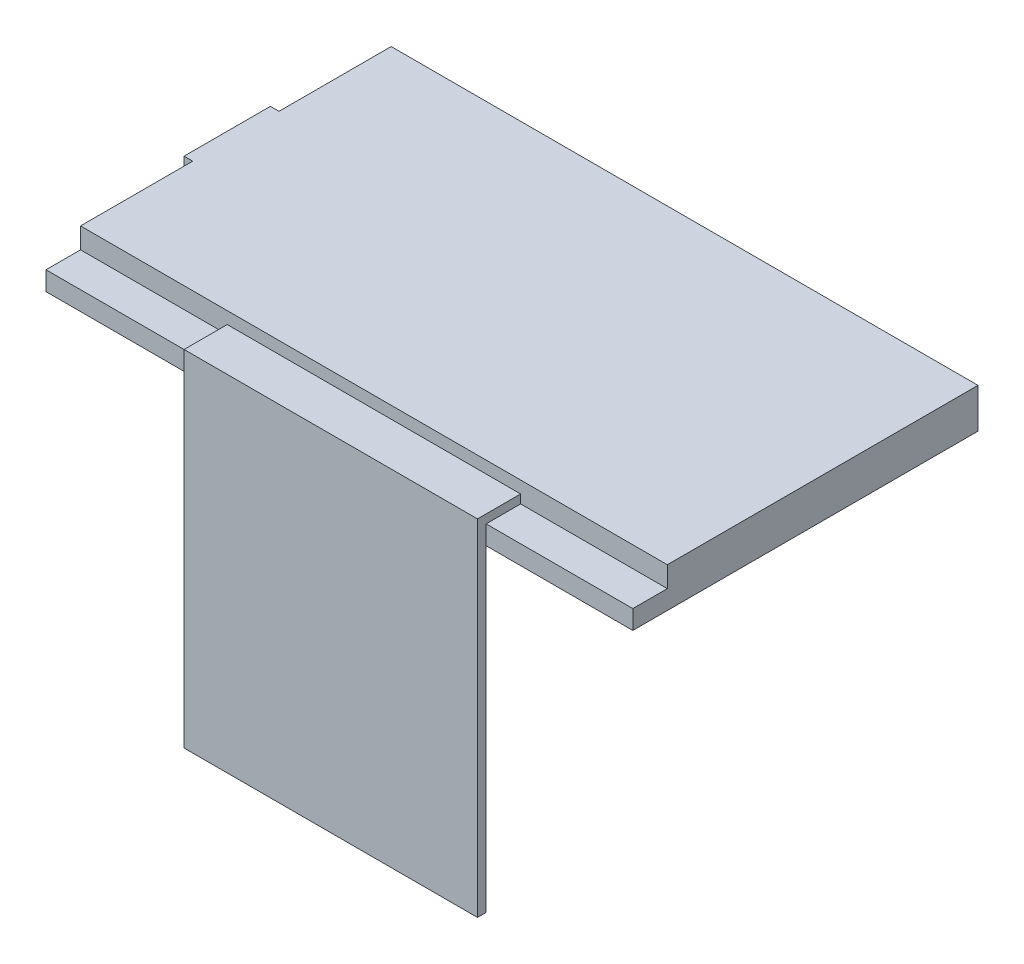
ISO-10303-21;
HEADER;
FILE_DESCRIPTION(('STEP AP214'),'2;1');
FILE_NAME('part.step','',(''),(''),'','','');
FILE_SCHEMA(('AUTOMOTIVE_DESIGN { 1 0 10303 214 1 1 1 1 }'));
ENDSEC;
DATA;
#1=APPLICATION_CONTEXT('core data for automotive mechanical design processes');
#2=APPLICATION_PROTOCOL_DEFINITION('international standard','automotive_design',2000,#1);
#3=PRODUCT_CONTEXT('',#1,'mechanical');
#4=PRODUCT('Part','Part','',(#3));
#5=PRODUCT_RELATED_PRODUCT_CATEGORY('part','',(#4));
#6=PRODUCT_DEFINITION_FORMATION('','',#4);
#7=PRODUCT_DEFINITION_CONTEXT('part definition',#1,'design');
#8=PRODUCT_DEFINITION('design','',#6,#7);
#9=PRODUCT_DEFINITION_SHAPE('','',#8);
#10=(LENGTH_UNIT() NAMED_UNIT(*) SI_UNIT(.MILLI.,.METRE.));
#11=(NAMED_UNIT(*) PLANE_ANGLE_UNIT() SI_UNIT($,.RADIAN.));
#12=(NAMED_UNIT(*) SI_UNIT($,.STERADIAN.) SOLID_ANGLE_UNIT());
#13=UNCERTAINTY_MEASURE_WITH_UNIT(LENGTH_MEASURE(1.E-05),#10,'distance_accuracy_value','');
#14=(GEOMETRIC_REPRESENTATION_CONTEXT(3) GLOBAL_UNCERTAINTY_ASSIGNED_CONTEXT((#13)) GLOBAL_UNIT_ASSIGNED_CONTEXT((#10,
#11,#12)) REPRESENTATION_CONTEXT('',''));
#15=CARTESIAN_POINT('',(0.,0.,0.));
#16=DIRECTION('',(0.,0.,1.));
#17=DIRECTION('',(1.,0.,0.));
#18=AXIS2_PLACEMENT_3D('',#15,#16,#17);
#19=CARTESIAN_POINT('',(-17.,1.1,10.));
#20=DIRECTION('',(0.,0.,-1.));
#21=DIRECTION('',(-1.,0.,0.));
#22=AXIS2_PLACEMENT_3D('',#19,#20,#21);
#23=PLANE('',#22);
#24=DIRECTION('',(0.,1.,0.));
#25=VECTOR('',#24,1.);
#26=CARTESIAN_POINT('',(8.5,-18.4,10.));
#27=LINE('',#26,#25);
#28=CARTESIAN_POINT('',(8.5,0.,10.));
#29=VERTEX_POINT('',#28);
#30=CARTESIAN_POINT('',(8.5,1.1,10.));
#31=VERTEX_POINT('',#30);
#32=EDGE_CURVE('E11',#29,#31,#27,.T.);
#33=ORIENTED_EDGE('',*,*,#32,.F.);
#34=DIRECTION('',(1.,0.,0.));
#35=VECTOR('',#34,1.);
#36=CARTESIAN_POINT('',(-17.,0.,10.));
#37=LINE('',#36,#35);
#38=CARTESIAN_POINT('',(17.,0.,10.));
#39=VERTEX_POINT('',#38);
#40=EDGE_CURVE('E277',#29,#39,#37,.T.);
#41=ORIENTED_EDGE('',*,*,#40,.T.);
#42=DIRECTION('',(0.,-1.,0.));
#43=VECTOR('',#42,1.);
#44=CARTESIAN_POINT('',(17.,1.1,10.));
#45=LINE('',#44,#43);
#46=CARTESIAN_POINT('',(17.,1.1,10.));
#47=VERTEX_POINT('',#46);
#48=EDGE_CURVE('E269',#47,#39,#45,.T.);
#49=ORIENTED_EDGE('',*,*,#48,.F.);
#50=DIRECTION('',(1.,0.,0.));
#51=VECTOR('',#50,1.);
#52=CARTESIAN_POINT('',(-17.,1.1,10.));
#53=LINE('',#52,#51);
#54=EDGE_CURVE('E265',#31,#47,#53,.T.);
#55=ORIENTED_EDGE('',*,*,#54,.F.);
#56=EDGE_LOOP('',(#33,#41,#49,#55));
#57=FACE_BOUND('',#56,.T.);
#58=ADVANCED_FACE('F33',(#57),#23,.F.);
#59=CARTESIAN_POINT('',(0.,1.1,0.));
#60=DIRECTION('',(0.,-1.,0.));
#61=DIRECTION('',(0.,0.,-1.));
#62=AXIS2_PLACEMENT_3D('',#59,#60,#61);
#63=PLANE('',#62);
#64=DIRECTION('',(0.,0.,1.));
#65=VECTOR('',#64,1.);
#66=CARTESIAN_POINT('',(-8.5,1.1,10.));
#67=LINE('',#66,#65);
#68=CARTESIAN_POINT('',(-8.5,1.1,8.));
#69=VERTEX_POINT('',#68);
#70=CARTESIAN_POINT('',(-8.5,1.1,10.));
#71=VERTEX_POINT('',#70);
#72=EDGE_CURVE('E188',#69,#71,#67,.T.);
#73=ORIENTED_EDGE('',*,*,#72,.F.);
#74=DIRECTION('',(1.,0.,0.));
#75=VECTOR('',#74,1.);
#76=CARTESIAN_POINT('',(-17.,1.1,8.));
#77=LINE('',#76,#75);
#78=CARTESIAN_POINT('',(-17.,1.1,8.));
#79=VERTEX_POINT('',#78);
#80=EDGE_CURVE('E250',#79,#69,#77,.T.);
#81=ORIENTED_EDGE('',*,*,#80,.F.);
#82=DIRECTION('',(0.,0.,1.));
#83=VECTOR('',#82,1.);
#84=CARTESIAN_POINT('',(-17.,1.1,10.));
#85=LINE('',#84,#83);
#86=CARTESIAN_POINT('',(-17.,1.1,10.));
#87=VERTEX_POINT('',#86);
#88=EDGE_CURVE('E262',#79,#87,#85,.T.);
#89=ORIENTED_EDGE('',*,*,#88,.T.);
#90=EDGE_CURVE('E266',#87,#71,#53,.T.);
#91=ORIENTED_EDGE('',*,*,#90,.T.);
#92=EDGE_LOOP('',(#73,#81,#89,#91));
#93=FACE_BOUND('',#92,.T.);
#94=ADVANCED_FACE('F308',(#93),#63,.F.);
#95=DIRECTION('',(0.,0.,-1.));
#96=VECTOR('',#95,1.);
#97=CARTESIAN_POINT('',(8.5,1.1,10.));
#98=LINE('',#97,#96);
#99=CARTESIAN_POINT('',(8.5,1.1,8.));
#100=VERTEX_POINT('',#99);
#101=EDGE_CURVE('E195',#31,#100,#98,.T.);
#102=ORIENTED_EDGE('',*,*,#101,.F.);
#103=ORIENTED_EDGE('',*,*,#54,.T.);
#104=DIRECTION('',(0.,0.,-1.));
#105=VECTOR('',#104,1.);
#106=CARTESIAN_POINT('',(17.,1.1,10.));
#107=LINE('',#106,#105);
#108=CARTESIAN_POINT('',(17.,1.1,8.));
#109=VERTEX_POINT('',#108);
#110=EDGE_CURVE('E259',#47,#109,#107,.T.);
#111=ORIENTED_EDGE('',*,*,#110,.T.);
#112=EDGE_CURVE('E236',#100,#109,#77,.T.);
#113=ORIENTED_EDGE('',*,*,#112,.F.);
#114=EDGE_LOOP('',(#102,#103,#111,#113));
#115=FACE_BOUND('',#114,.T.);
#116=ADVANCED_FACE('F338',(#115),#63,.F.);
#117=CARTESIAN_POINT('',(-17.,2.3,8.));
#118=DIRECTION('',(0.,0.,-1.));
#119=DIRECTION('',(-1.,0.,0.));
#120=AXIS2_PLACEMENT_3D('',#117,#118,#119);
#121=PLANE('',#120);
#122=DIRECTION('',(0.,-1.,0.));
#123=VECTOR('',#122,1.);
#124=CARTESIAN_POINT('',(-8.5,1.6,8.));
#125=LINE('',#124,#123);
#126=CARTESIAN_POINT('',(-8.5,1.6,8.));
#127=VERTEX_POINT('',#126);
#128=EDGE_CURVE('E201',#127,#69,#125,.T.);
#129=ORIENTED_EDGE('',*,*,#128,.F.);
#130=DIRECTION('',(-1.,0.,0.));
#131=VECTOR('',#130,1.);
#132=CARTESIAN_POINT('',(-8.5,1.6,8.));
#133=LINE('',#132,#131);
#134=CARTESIAN_POINT('',(8.5,1.6,8.));
#135=VERTEX_POINT('',#134);
#136=EDGE_CURVE('E198',#135,#127,#133,.T.);
#137=ORIENTED_EDGE('',*,*,#136,.F.);
#138=DIRECTION('',(0.,-1.,0.));
#139=VECTOR('',#138,1.);
#140=CARTESIAN_POINT('',(8.5,1.6,7.99999999999999));
#141=LINE('',#140,#139);
#142=EDGE_CURVE('E207',#135,#100,#141,.T.);
#143=ORIENTED_EDGE('',*,*,#142,.T.);
#144=ORIENTED_EDGE('',*,*,#112,.T.);
#145=DIRECTION('',(0.,-1.,0.));
#146=VECTOR('',#145,1.);
#147=CARTESIAN_POINT('',(17.,2.3,8.));
#148=LINE('',#147,#146);
#149=CARTESIAN_POINT('',(17.,2.3,8.));
#150=VERTEX_POINT('',#149);
#151=EDGE_CURVE('E249',#150,#109,#148,.T.);
#152=ORIENTED_EDGE('',*,*,#151,.F.);
#153=DIRECTION('',(1.,0.,0.));
#154=VECTOR('',#153,1.);
#155=CARTESIAN_POINT('',(-17.,2.3,8.));
#156=LINE('',#155,#154);
#157=CARTESIAN_POINT('',(-17.,2.3,8.));
#158=VERTEX_POINT('',#157);
#159=EDGE_CURVE('E240',#158,#150,#156,.T.);
#160=ORIENTED_EDGE('',*,*,#159,.F.);
#161=DIRECTION('',(0.,-1.,0.));
#162=VECTOR('',#161,1.);
#163=CARTESIAN_POINT('',(-17.,2.3,8.));
#164=LINE('',#163,#162);
#165=EDGE_CURVE('E255',#158,#79,#164,.T.);
#166=ORIENTED_EDGE('',*,*,#165,.T.);
#167=ORIENTED_EDGE('',*,*,#80,.T.);
#168=EDGE_LOOP('',(#129,#137,#143,#144,#152,#160,#166,#167));
#169=FACE_BOUND('',#168,.T.);
#170=ADVANCED_FACE('F303',(#169),#121,.F.);
#171=CARTESIAN_POINT('',(-17.,1.1,10.));
#172=DIRECTION('',(1.,0.,0.));
#173=DIRECTION('',(0.,0.,-1.));
#174=AXIS2_PLACEMENT_3D('',#171,#172,#173);
#175=PLANE('',#174);
#176=DIRECTION('',(0.,-1.,0.));
#177=VECTOR('',#176,1.);
#178=CARTESIAN_POINT('',(-17.,0.,-3.5));
#179=LINE('',#178,#177);
#180=CARTESIAN_POINT('',(-17.,2.3,-3.5));
#181=VERTEX_POINT('',#180);
#182=CARTESIAN_POINT('',(-17.,0.,-3.5));
#183=VERTEX_POINT('',#182);
#184=EDGE_CURVE('E209',#181,#183,#179,.T.);
#185=ORIENTED_EDGE('',*,*,#184,.F.);
#186=DIRECTION('',(0.,0.,1.));
#187=VECTOR('',#186,1.);
#188=CARTESIAN_POINT('',(-17.,2.3,-10.));
#189=LINE('',#188,#187);
#190=CARTESIAN_POINT('',(-17.,2.3,-10.));
#191=VERTEX_POINT('',#190);
#192=EDGE_CURVE('E237',#191,#181,#189,.T.);
#193=ORIENTED_EDGE('',*,*,#192,.F.);
#194=DIRECTION('',(0.,-1.,0.));
#195=VECTOR('',#194,1.);
#196=CARTESIAN_POINT('',(-17.,1.1,-10.));
#197=LINE('',#196,#195);
#198=CARTESIAN_POINT('',(-17.,0.,-10.));
#199=VERTEX_POINT('',#198);
#200=EDGE_CURVE('E283',#191,#199,#197,.T.);
#201=ORIENTED_EDGE('',*,*,#200,.T.);
#202=DIRECTION('',(0.,0.,1.));
#203=VECTOR('',#202,1.);
#204=CARTESIAN_POINT('',(-17.,0.,10.));
#205=LINE('',#204,#203);
#206=EDGE_CURVE('E275',#199,#183,#205,.T.);
#207=ORIENTED_EDGE('',*,*,#206,.T.);
#208=EDGE_LOOP('',(#185,#193,#201,#207));
#209=FACE_BOUND('',#208,.T.);
#210=ADVANCED_FACE('F328',(#209),#175,.F.);
#211=DIRECTION('',(0.,1.,0.));
#212=VECTOR('',#211,1.);
#213=CARTESIAN_POINT('',(-17.,0.,1.5));
#214=LINE('',#213,#212);
#215=CARTESIAN_POINT('',(-17.,0.,1.5));
#216=VERTEX_POINT('',#215);
#217=CARTESIAN_POINT('',(-17.,2.3,1.5));
#218=VERTEX_POINT('',#217);
#219=EDGE_CURVE('E214',#216,#218,#214,.T.);
#220=ORIENTED_EDGE('',*,*,#219,.F.);
#221=CARTESIAN_POINT('',(-17.,0.,10.));
#222=VERTEX_POINT('',#221);
#223=EDGE_CURVE('E274',#216,#222,#205,.T.);
#224=ORIENTED_EDGE('',*,*,#223,.T.);
#225=DIRECTION('',(0.,-1.,0.));
#226=VECTOR('',#225,1.);
#227=CARTESIAN_POINT('',(-17.,1.1,10.));
#228=LINE('',#227,#226);
#229=EDGE_CURVE('E281',#87,#222,#228,.T.);
#230=ORIENTED_EDGE('',*,*,#229,.F.);
#231=ORIENTED_EDGE('',*,*,#88,.F.);
#232=ORIENTED_EDGE('',*,*,#165,.F.);
#233=EDGE_CURVE('E241',#218,#158,#189,.T.);
#234=ORIENTED_EDGE('',*,*,#233,.F.);
#235=EDGE_LOOP('',(#220,#224,#230,#231,#232,#234));
#236=FACE_BOUND('',#235,.T.);
#237=ADVANCED_FACE('F311',(#236),#175,.F.);
#238=CARTESIAN_POINT('',(17.,1.1,10.));
#239=DIRECTION('',(-1.,0.,0.));
#240=DIRECTION('',(0.,0.,1.));
#241=AXIS2_PLACEMENT_3D('',#238,#239,#240);
#242=PLANE('',#241);
#243=DIRECTION('',(0.,0.,-1.));
#244=VECTOR('',#243,1.);
#245=CARTESIAN_POINT('',(17.,0.,10.));
#246=LINE('',#245,#244);
#247=CARTESIAN_POINT('',(17.,0.,-10.));
#248=VERTEX_POINT('',#247);
#249=EDGE_CURVE('E258',#39,#248,#246,.T.);
#250=ORIENTED_EDGE('',*,*,#249,.T.);
#251=DIRECTION('',(0.,-1.,0.));
#252=VECTOR('',#251,1.);
#253=CARTESIAN_POINT('',(17.,1.1,-10.));
#254=LINE('',#253,#252);
#255=CARTESIAN_POINT('',(17.,2.3,-10.));
#256=VERTEX_POINT('',#255);
#257=EDGE_CURVE('E37',#256,#248,#254,.T.);
#258=ORIENTED_EDGE('',*,*,#257,.F.);
#259=DIRECTION('',(0.,0.,-1.));
#260=VECTOR('',#259,1.);
#261=CARTESIAN_POINT('',(17.,2.3,-10.));
#262=LINE('',#261,#260);
#263=EDGE_CURVE('E243',#150,#256,#262,.T.);
#264=ORIENTED_EDGE('',*,*,#263,.F.);
#265=ORIENTED_EDGE('',*,*,#151,.T.);
#266=ORIENTED_EDGE('',*,*,#110,.F.);
#267=ORIENTED_EDGE('',*,*,#48,.T.);
#268=EDGE_LOOP('',(#250,#258,#264,#265,#266,#267));
#269=FACE_BOUND('',#268,.T.);
#270=ADVANCED_FACE('F35',(#269),#242,.F.);
#271=CARTESIAN_POINT('',(-17.,1.1,-10.));
#272=DIRECTION('',(0.,0.,1.));
#273=DIRECTION('',(1.,0.,0.));
#274=AXIS2_PLACEMENT_3D('',#271,#272,#273);
#275=PLANE('',#274);
#276=DIRECTION('',(-1.,0.,0.));
#277=VECTOR('',#276,1.);
#278=CARTESIAN_POINT('',(-17.,0.,-10.));
#279=LINE('',#278,#277);
#280=EDGE_CURVE('E272',#248,#199,#279,.T.);
#281=ORIENTED_EDGE('',*,*,#280,.T.);
#282=ORIENTED_EDGE('',*,*,#200,.F.);
#283=DIRECTION('',(-1.,0.,0.));
#284=VECTOR('',#283,1.);
#285=CARTESIAN_POINT('',(-17.,2.3,-10.));
#286=LINE('',#285,#284);
#287=EDGE_CURVE('E246',#256,#191,#286,.T.);
#288=ORIENTED_EDGE('',*,*,#287,.F.);
#289=ORIENTED_EDGE('',*,*,#257,.T.);
#290=EDGE_LOOP('',(#281,#282,#288,#289));
#291=FACE_BOUND('',#290,.T.);
#292=ADVANCED_FACE('F332',(#291),#275,.F.);
#293=CARTESIAN_POINT('',(-8.5,0.,10.));
#294=VERTEX_POINT('',#293);
#295=EDGE_CURVE('E263',#222,#294,#37,.T.);
#296=ORIENTED_EDGE('',*,*,#295,.T.);
#297=DIRECTION('',(0.,1.,0.));
#298=VECTOR('',#297,1.);
#299=CARTESIAN_POINT('',(-8.5,-18.4,10.));
#300=LINE('',#299,#298);
#301=EDGE_CURVE('E42',#294,#71,#300,.T.);
#302=ORIENTED_EDGE('',*,*,#301,.T.);
#303=ORIENTED_EDGE('',*,*,#90,.F.);
#304=ORIENTED_EDGE('',*,*,#229,.T.);
#305=EDGE_LOOP('',(#296,#302,#303,#304));
#306=FACE_BOUND('',#305,.T.);
#307=ADVANCED_FACE('F294',(#306),#23,.F.);
#308=CARTESIAN_POINT('',(0.,0.,0.));
#309=DIRECTION('',(0.,-1.,0.));
#310=DIRECTION('',(0.,0.,-1.));
#311=AXIS2_PLACEMENT_3D('',#308,#309,#310);
#312=PLANE('',#311);
#313=ORIENTED_EDGE('',*,*,#249,.F.);
#314=ORIENTED_EDGE('',*,*,#40,.F.);
#315=EDGE_CURVE('E56',#294,#29,#37,.T.);
#316=ORIENTED_EDGE('',*,*,#315,.F.);
#317=ORIENTED_EDGE('',*,*,#295,.F.);
#318=ORIENTED_EDGE('',*,*,#223,.F.);
#319=DIRECTION('',(1.,0.,0.));
#320=VECTOR('',#319,1.);
#321=CARTESIAN_POINT('',(-17.5,0.,1.5));
#322=LINE('',#321,#320);
#323=CARTESIAN_POINT('',(-17.5,0.,1.5));
#324=VERTEX_POINT('',#323);
#325=EDGE_CURVE('E230',#324,#216,#322,.T.);
#326=ORIENTED_EDGE('',*,*,#325,.F.);
#327=DIRECTION('',(0.,0.,1.));
#328=VECTOR('',#327,1.);
#329=CARTESIAN_POINT('',(-17.5,0.,-3.5));
#330=LINE('',#329,#328);
#331=CARTESIAN_POINT('',(-17.5,0.,-3.5));
#332=VERTEX_POINT('',#331);
#333=EDGE_CURVE('E213',#332,#324,#330,.T.);
#334=ORIENTED_EDGE('',*,*,#333,.F.);
#335=DIRECTION('',(1.,0.,0.));
#336=VECTOR('',#335,1.);
#337=CARTESIAN_POINT('',(-17.5,0.,-3.5));
#338=LINE('',#337,#336);
#339=EDGE_CURVE('E233',#332,#183,#338,.T.);
#340=ORIENTED_EDGE('',*,*,#339,.T.);
#341=ORIENTED_EDGE('',*,*,#206,.F.);
#342=ORIENTED_EDGE('',*,*,#280,.F.);
#343=EDGE_LOOP('',(#313,#314,#316,#317,#318,#326,#334,#340,#341,#342));
#344=FACE_BOUND('',#343,.T.);
#345=ADVANCED_FACE('F314',(#344),#312,.T.);
#346=CARTESIAN_POINT('',(0.,2.3,0.));
#347=DIRECTION('',(0.,1.,0.));
#348=DIRECTION('',(0.,0.,1.));
#349=AXIS2_PLACEMENT_3D('',#346,#347,#348);
#350=PLANE('',#349);
#351=ORIENTED_EDGE('',*,*,#192,.T.);
#352=DIRECTION('',(1.,0.,0.));
#353=VECTOR('',#352,1.);
#354=CARTESIAN_POINT('',(-17.5,2.3,-3.5));
#355=LINE('',#354,#353);
#356=CARTESIAN_POINT('',(-17.5,2.3,-3.5));
#357=VERTEX_POINT('',#356);
#358=EDGE_CURVE('E220',#357,#181,#355,.T.);
#359=ORIENTED_EDGE('',*,*,#358,.F.);
#360=DIRECTION('',(0.,0.,-1.));
#361=VECTOR('',#360,1.);
#362=CARTESIAN_POINT('',(-17.5,2.3,-3.5));
#363=LINE('',#362,#361);
#364=CARTESIAN_POINT('',(-17.5,2.3,1.5));
#365=VERTEX_POINT('',#364);
#366=EDGE_CURVE('E218',#365,#357,#363,.T.);
#367=ORIENTED_EDGE('',*,*,#366,.F.);
#368=DIRECTION('',(1.,0.,0.));
#369=VECTOR('',#368,1.);
#370=CARTESIAN_POINT('',(-17.5,2.3,1.5));
#371=LINE('',#370,#369);
#372=EDGE_CURVE('E227',#365,#218,#371,.T.);
#373=ORIENTED_EDGE('',*,*,#372,.T.);
#374=ORIENTED_EDGE('',*,*,#233,.T.);
#375=ORIENTED_EDGE('',*,*,#159,.T.);
#376=ORIENTED_EDGE('',*,*,#263,.T.);
#377=ORIENTED_EDGE('',*,*,#287,.T.);
#378=EDGE_LOOP('',(#351,#359,#367,#373,#374,#375,#376,#377));
#379=FACE_BOUND('',#378,.T.);
#380=ADVANCED_FACE('F330',(#379),#350,.T.);
#381=CARTESIAN_POINT('',(-17.5,0.,-3.5));
#382=DIRECTION('',(0.,0.,1.));
#383=DIRECTION('',(1.,0.,0.));
#384=AXIS2_PLACEMENT_3D('',#381,#382,#383);
#385=PLANE('',#384);
#386=ORIENTED_EDGE('',*,*,#184,.T.);
#387=ORIENTED_EDGE('',*,*,#339,.F.);
#388=DIRECTION('',(0.,-1.,0.));
#389=VECTOR('',#388,1.);
#390=CARTESIAN_POINT('',(-17.5,0.,-3.5));
#391=LINE('',#390,#389);
#392=EDGE_CURVE('E210',#357,#332,#391,.T.);
#393=ORIENTED_EDGE('',*,*,#392,.F.);
#394=ORIENTED_EDGE('',*,*,#358,.T.);
#395=EDGE_LOOP('',(#386,#387,#393,#394));
#396=FACE_BOUND('',#395,.T.);
#397=ADVANCED_FACE('F327',(#396),#385,.F.);
#398=CARTESIAN_POINT('',(-17.5,0.,1.5));
#399=DIRECTION('',(0.,0.,-1.));
#400=DIRECTION('',(-1.,0.,0.));
#401=AXIS2_PLACEMENT_3D('',#398,#399,#400);
#402=PLANE('',#401);
#403=ORIENTED_EDGE('',*,*,#219,.T.);
#404=ORIENTED_EDGE('',*,*,#372,.F.);
#405=DIRECTION('',(0.,1.,0.));
#406=VECTOR('',#405,1.);
#407=CARTESIAN_POINT('',(-17.5,0.,1.5));
#408=LINE('',#407,#406);
#409=EDGE_CURVE('E216',#324,#365,#408,.T.);
#410=ORIENTED_EDGE('',*,*,#409,.F.);
#411=ORIENTED_EDGE('',*,*,#325,.T.);
#412=EDGE_LOOP('',(#403,#404,#410,#411));
#413=FACE_BOUND('',#412,.T.);
#414=ADVANCED_FACE('F318',(#413),#402,.F.);
#415=CARTESIAN_POINT('',(-17.5,0.,0.));
#416=DIRECTION('',(1.,0.,0.));
#417=DIRECTION('',(0.,0.,-1.));
#418=AXIS2_PLACEMENT_3D('',#415,#416,#417);
#419=PLANE('',#418);
#420=ORIENTED_EDGE('',*,*,#392,.T.);
#421=ORIENTED_EDGE('',*,*,#333,.T.);
#422=ORIENTED_EDGE('',*,*,#409,.T.);
#423=ORIENTED_EDGE('',*,*,#366,.T.);
#424=EDGE_LOOP('',(#420,#421,#422,#423));
#425=FACE_BOUND('',#424,.T.);
#426=ADVANCED_FACE('F322',(#425),#419,.F.);
#427=CARTESIAN_POINT('',(-8.5,1.6,10.));
#428=DIRECTION('',(1.,0.,0.));
#429=DIRECTION('',(0.,0.,-1.));
#430=AXIS2_PLACEMENT_3D('',#427,#428,#429);
#431=PLANE('',#430);
#432=ORIENTED_EDGE('',*,*,#72,.T.);
#433=ORIENTED_EDGE('',*,*,#301,.F.);
#434=CARTESIAN_POINT('',(-8.5,-18.4,10.));
#435=VERTEX_POINT('',#434);
#436=EDGE_CURVE('E182',#435,#294,#300,.T.);
#437=ORIENTED_EDGE('',*,*,#436,.F.);
#438=DIRECTION('',(0.,0.,1.));
#439=VECTOR('',#438,1.);
#440=CARTESIAN_POINT('',(-8.5,-18.4,10.));
#441=LINE('',#440,#439);
#442=CARTESIAN_POINT('',(-8.5,-18.4,10.5));
#443=VERTEX_POINT('',#442);
#444=EDGE_CURVE('E174',#435,#443,#441,.T.);
#445=ORIENTED_EDGE('',*,*,#444,.T.);
#446=DIRECTION('',(0.,1.,0.));
#447=VECTOR('',#446,1.);
#448=CARTESIAN_POINT('',(-8.5,-18.4,10.5));
#449=LINE('',#448,#447);
#450=CARTESIAN_POINT('',(-8.5,1.6,10.5));
#451=VERTEX_POINT('',#450);
#452=EDGE_CURVE('E156',#443,#451,#449,.T.);
#453=ORIENTED_EDGE('',*,*,#452,.T.);
#454=DIRECTION('',(0.,0.,1.));
#455=VECTOR('',#454,1.);
#456=CARTESIAN_POINT('',(-8.5,1.6,10.));
#457=LINE('',#456,#455);
#458=EDGE_CURVE('E192',#127,#451,#457,.T.);
#459=ORIENTED_EDGE('',*,*,#458,.F.);
#460=ORIENTED_EDGE('',*,*,#128,.T.);
#461=EDGE_LOOP('',(#432,#433,#437,#445,#453,#459,#460));
#462=FACE_BOUND('',#461,.T.);
#463=ADVANCED_FACE('F179',(#462),#431,.F.);
#464=CARTESIAN_POINT('',(8.5,1.6,10.));
#465=DIRECTION('',(-1.,0.,0.));
#466=DIRECTION('',(0.,0.,1.));
#467=AXIS2_PLACEMENT_3D('',#464,#465,#466);
#468=PLANE('',#467);
#469=ORIENTED_EDGE('',*,*,#101,.T.);
#470=ORIENTED_EDGE('',*,*,#142,.F.);
#471=DIRECTION('',(0.,0.,-1.));
#472=VECTOR('',#471,1.);
#473=CARTESIAN_POINT('',(8.5,1.6,10.));
#474=LINE('',#473,#472);
#475=CARTESIAN_POINT('',(8.5,1.6,10.5));
#476=VERTEX_POINT('',#475);
#477=EDGE_CURVE('E194',#476,#135,#474,.T.);
#478=ORIENTED_EDGE('',*,*,#477,.F.);
#479=DIRECTION('',(0.,1.,0.));
#480=VECTOR('',#479,1.);
#481=CARTESIAN_POINT('',(8.5,-18.4,10.5));
#482=LINE('',#481,#480);
#483=CARTESIAN_POINT('',(8.5,-18.4,10.5));
#484=VERTEX_POINT('',#483);
#485=EDGE_CURVE('E166',#484,#476,#482,.T.);
#486=ORIENTED_EDGE('',*,*,#485,.F.);
#487=DIRECTION('',(0.,0.,-1.));
#488=VECTOR('',#487,1.);
#489=CARTESIAN_POINT('',(8.5,-18.4,10.));
#490=LINE('',#489,#488);
#491=CARTESIAN_POINT('',(8.5,-18.4,10.));
#492=VERTEX_POINT('',#491);
#493=EDGE_CURVE('E177',#484,#492,#490,.T.);
#494=ORIENTED_EDGE('',*,*,#493,.T.);
#495=EDGE_CURVE('E44',#492,#29,#27,.T.);
#496=ORIENTED_EDGE('',*,*,#495,.T.);
#497=ORIENTED_EDGE('',*,*,#32,.T.);
#498=EDGE_LOOP('',(#469,#470,#478,#486,#494,#496,#497));
#499=FACE_BOUND('',#498,.T.);
#500=ADVANCED_FACE('F298',(#499),#468,.F.);
#501=CARTESIAN_POINT('',(0.,1.6,0.));
#502=DIRECTION('',(0.,-1.,0.));
#503=DIRECTION('',(0.,0.,-1.));
#504=AXIS2_PLACEMENT_3D('',#501,#502,#503);
#505=PLANE('',#504);
#506=ORIENTED_EDGE('',*,*,#458,.T.);
#507=DIRECTION('',(1.,0.,0.));
#508=VECTOR('',#507,1.);
#509=CARTESIAN_POINT('',(-8.5,1.6,10.5));
#510=LINE('',#509,#508);
#511=EDGE_CURVE('E162',#451,#476,#510,.T.);
#512=ORIENTED_EDGE('',*,*,#511,.T.);
#513=ORIENTED_EDGE('',*,*,#477,.T.);
#514=ORIENTED_EDGE('',*,*,#136,.T.);
#515=EDGE_LOOP('',(#506,#512,#513,#514));
#516=FACE_BOUND('',#515,.T.);
#517=ADVANCED_FACE('F301',(#516),#505,.F.);
#518=CARTESIAN_POINT('',(-8.5,-18.4,10.));
#519=DIRECTION('',(0.,0.,-1.));
#520=DIRECTION('',(-1.,0.,0.));
#521=AXIS2_PLACEMENT_3D('',#518,#519,#520);
#522=PLANE('',#521);
#523=ORIENTED_EDGE('',*,*,#436,.T.);
#524=ORIENTED_EDGE('',*,*,#315,.T.);
#525=ORIENTED_EDGE('',*,*,#495,.F.);
#526=DIRECTION('',(-1.,0.,0.));
#527=VECTOR('',#526,1.);
#528=CARTESIAN_POINT('',(-8.5,-18.4,10.));
#529=LINE('',#528,#527);
#530=EDGE_CURVE('E167',#492,#435,#529,.T.);
#531=ORIENTED_EDGE('',*,*,#530,.T.);
#532=EDGE_LOOP('',(#523,#524,#525,#531));
#533=FACE_BOUND('',#532,.T.);
#534=ADVANCED_FACE('F296',(#533),#522,.T.);
#535=CARTESIAN_POINT('',(-8.5,-18.4,10.5));
#536=DIRECTION('',(0.,0.,1.));
#537=DIRECTION('',(1.,0.,0.));
#538=AXIS2_PLACEMENT_3D('',#535,#536,#537);
#539=PLANE('',#538);
#540=ORIENTED_EDGE('',*,*,#511,.F.);
#541=ORIENTED_EDGE('',*,*,#452,.F.);
#542=DIRECTION('',(1.,0.,0.));
#543=VECTOR('',#542,1.);
#544=CARTESIAN_POINT('',(-8.5,-18.4,10.5));
#545=LINE('',#544,#543);
#546=EDGE_CURVE('E160',#443,#484,#545,.T.);
#547=ORIENTED_EDGE('',*,*,#546,.T.);
#548=ORIENTED_EDGE('',*,*,#485,.T.);
#549=EDGE_LOOP('',(#540,#541,#547,#548));
#550=FACE_BOUND('',#549,.T.);
#551=ADVANCED_FACE('F158',(#550),#539,.T.);
#552=CARTESIAN_POINT('',(0.,-18.4,0.));
#553=DIRECTION('',(0.,1.,0.));
#554=DIRECTION('',(0.,0.,1.));
#555=AXIS2_PLACEMENT_3D('',#552,#553,#554);
#556=PLANE('',#555);
#557=ORIENTED_EDGE('',*,*,#444,.F.);
#558=ORIENTED_EDGE('',*,*,#530,.F.);
#559=ORIENTED_EDGE('',*,*,#493,.F.);
#560=ORIENTED_EDGE('',*,*,#546,.F.);
#561=EDGE_LOOP('',(#557,#558,#559,#560));
#562=FACE_BOUND('',#561,.T.);
#563=ADVANCED_FACE('F172',(#562),#556,.F.);
#564=CLOSED_SHELL('',(#58,#94,#116,#170,#210,#237,#270,#292,#307,#345,#380,#397,#414,#426,#463,
#500,#517,#534,#551,#563));
#565=MANIFOLD_SOLID_BREP('B2',#564);
#566=ADVANCED_BREP_SHAPE_REPRESENTATION('',(#18,#565),#14);
#567=SHAPE_DEFINITION_REPRESENTATION(#9,#566);
ENDSEC;
END-ISO-10303-21;
